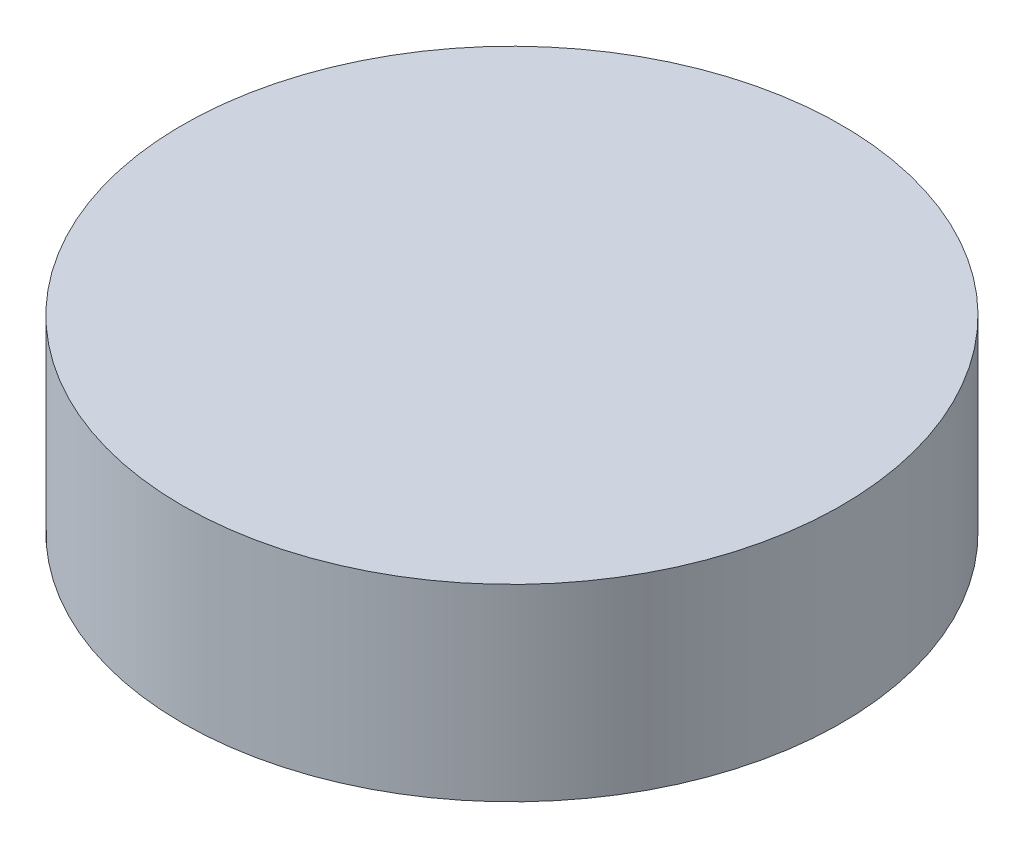
ISO-10303-21;
HEADER;
FILE_DESCRIPTION(('STEP AP214'),'2;1');
FILE_NAME('part.step','',(''),(''),'','','');
FILE_SCHEMA(('AUTOMOTIVE_DESIGN { 1 0 10303 214 1 1 1 1 }'));
ENDSEC;
DATA;
#1=APPLICATION_CONTEXT('core data for automotive mechanical design processes');
#2=APPLICATION_PROTOCOL_DEFINITION('international standard','automotive_design',2000,#1);
#3=PRODUCT_CONTEXT('',#1,'mechanical');
#4=PRODUCT('Part','Part','',(#3));
#5=PRODUCT_RELATED_PRODUCT_CATEGORY('part','',(#4));
#6=PRODUCT_DEFINITION_FORMATION('','',#4);
#7=PRODUCT_DEFINITION_CONTEXT('part definition',#1,'design');
#8=PRODUCT_DEFINITION('design','',#6,#7);
#9=PRODUCT_DEFINITION_SHAPE('','',#8);
#10=(LENGTH_UNIT() NAMED_UNIT(*) SI_UNIT(.MILLI.,.METRE.));
#11=(NAMED_UNIT(*) PLANE_ANGLE_UNIT() SI_UNIT($,.RADIAN.));
#12=(NAMED_UNIT(*) SI_UNIT($,.STERADIAN.) SOLID_ANGLE_UNIT());
#13=UNCERTAINTY_MEASURE_WITH_UNIT(LENGTH_MEASURE(1.E-05),#10,'distance_accuracy_value','');
#14=(GEOMETRIC_REPRESENTATION_CONTEXT(3) GLOBAL_UNCERTAINTY_ASSIGNED_CONTEXT((#13)) GLOBAL_UNIT_ASSIGNED_CONTEXT((#10,
#11,#12)) REPRESENTATION_CONTEXT('',''));
#15=CARTESIAN_POINT('',(0.,0.,0.));
#16=DIRECTION('',(0.,0.,1.));
#17=DIRECTION('',(1.,0.,0.));
#18=AXIS2_PLACEMENT_3D('',#15,#16,#17);
#19=CARTESIAN_POINT('',(0.,20.,0.));
#20=DIRECTION('',(0.,-1.,0.));
#21=DIRECTION('',(0.,0.,-1.));
#22=AXIS2_PLACEMENT_3D('',#19,#20,#21);
#23=CYLINDRICAL_SURFACE('',#22,35.);
#24=CARTESIAN_POINT('',(0.,20.,0.));
#25=DIRECTION('',(0.,1.,0.));
#26=DIRECTION('',(0.,0.,1.));
#27=AXIS2_PLACEMENT_3D('',#24,#25,#26);
#28=CIRCLE('',#27,35.);
#29=CARTESIAN_POINT('',(0.,20.,35.));
#30=VERTEX_POINT('',#29);
#31=EDGE_CURVE('E10',#30,#30,#28,.T.);
#32=ORIENTED_EDGE('',*,*,#31,.F.);
#33=EDGE_LOOP('',(#32));
#34=FACE_BOUND('',#33,.T.);
#35=CARTESIAN_POINT('',(0.,0.,0.));
#36=DIRECTION('',(0.,1.,0.));
#37=DIRECTION('',(0.,0.,1.));
#38=AXIS2_PLACEMENT_3D('',#35,#36,#37);
#39=CIRCLE('',#38,35.);
#40=CARTESIAN_POINT('',(0.,0.,35.));
#41=VERTEX_POINT('',#40);
#42=EDGE_CURVE('E42',#41,#41,#39,.T.);
#43=ORIENTED_EDGE('',*,*,#42,.T.);
#44=EDGE_LOOP('',(#43));
#45=FACE_BOUND('',#44,.T.);
#46=ADVANCED_FACE('F39',(#34,#45),#23,.T.);
#47=CARTESIAN_POINT('',(0.,20.,0.));
#48=DIRECTION('',(0.,1.,0.));
#49=DIRECTION('',(0.,0.,1.));
#50=AXIS2_PLACEMENT_3D('',#47,#48,#49);
#51=PLANE('',#50);
#52=ORIENTED_EDGE('',*,*,#31,.T.);
#53=EDGE_LOOP('',(#52));
#54=FACE_BOUND('',#53,.T.);
#55=ADVANCED_FACE('F54',(#54),#51,.T.);
#56=CARTESIAN_POINT('',(0.,0.,0.));
#57=DIRECTION('',(0.,1.,0.));
#58=DIRECTION('',(0.,0.,1.));
#59=AXIS2_PLACEMENT_3D('',#56,#57,#58);
#60=PLANE('',#59);
#61=ORIENTED_EDGE('',*,*,#42,.F.);
#62=EDGE_LOOP('',(#61));
#63=FACE_BOUND('',#62,.T.);
#64=ADVANCED_FACE('F52',(#63),#60,.F.);
#65=CLOSED_SHELL('',(#46,#55,#64));
#66=MANIFOLD_SOLID_BREP('B2',#65);
#67=ADVANCED_BREP_SHAPE_REPRESENTATION('',(#18,#66),#14);
#68=SHAPE_DEFINITION_REPRESENTATION(#9,#67);
ENDSEC;
END-ISO-10303-21;
